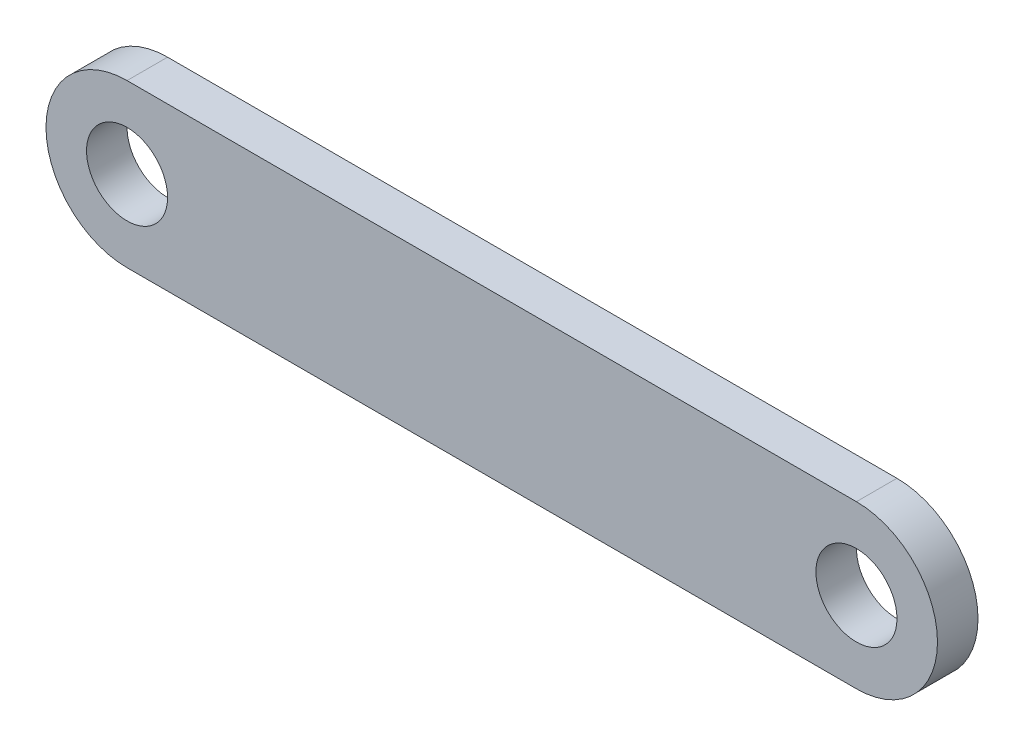
ISO-10303-21;
HEADER;
FILE_DESCRIPTION(('STEP AP214'),'2;1');
FILE_NAME('part.step','',(''),(''),'','','');
FILE_SCHEMA(('AUTOMOTIVE_DESIGN { 1 0 10303 214 1 1 1 1 }'));
ENDSEC;
DATA;
#1=APPLICATION_CONTEXT('core data for automotive mechanical design processes');
#2=APPLICATION_PROTOCOL_DEFINITION('international standard','automotive_design',2000,#1);
#3=PRODUCT_CONTEXT('',#1,'mechanical');
#4=PRODUCT('Part','Part','',(#3));
#5=PRODUCT_RELATED_PRODUCT_CATEGORY('part','',(#4));
#6=PRODUCT_DEFINITION_FORMATION('','',#4);
#7=PRODUCT_DEFINITION_CONTEXT('part definition',#1,'design');
#8=PRODUCT_DEFINITION('design','',#6,#7);
#9=PRODUCT_DEFINITION_SHAPE('','',#8);
#10=(LENGTH_UNIT() NAMED_UNIT(*) SI_UNIT(.MILLI.,.METRE.));
#11=(NAMED_UNIT(*) PLANE_ANGLE_UNIT() SI_UNIT($,.RADIAN.));
#12=(NAMED_UNIT(*) SI_UNIT($,.STERADIAN.) SOLID_ANGLE_UNIT());
#13=UNCERTAINTY_MEASURE_WITH_UNIT(LENGTH_MEASURE(1.E-05),#10,'distance_accuracy_value','');
#14=(GEOMETRIC_REPRESENTATION_CONTEXT(3) GLOBAL_UNCERTAINTY_ASSIGNED_CONTEXT((#13)) GLOBAL_UNIT_ASSIGNED_CONTEXT((#10,
#11,#12)) REPRESENTATION_CONTEXT('',''));
#15=CARTESIAN_POINT('',(0.,0.,0.));
#16=DIRECTION('',(0.,0.,1.));
#17=DIRECTION('',(1.,0.,0.));
#18=AXIS2_PLACEMENT_3D('',#15,#16,#17);
#19=CARTESIAN_POINT('',(-22.5,0.,2.5));
#20=DIRECTION('',(0.,0.,1.));
#21=DIRECTION('',(1.,0.,0.));
#22=AXIS2_PLACEMENT_3D('',#19,#20,#21);
#23=PLANE('',#22);
#24=CARTESIAN_POINT('',(-22.5,0.,2.5));
#25=DIRECTION('',(0.,0.,1.));
#26=DIRECTION('',(1.,0.,0.));
#27=AXIS2_PLACEMENT_3D('',#24,#25,#26);
#28=CIRCLE('',#27,2.5);
#29=CARTESIAN_POINT('',(-20.,0.,2.5));
#30=VERTEX_POINT('',#29);
#31=EDGE_CURVE('E116',#30,#30,#28,.T.);
#32=ORIENTED_EDGE('',*,*,#31,.F.);
#33=EDGE_LOOP('',(#32));
#34=FACE_BOUND('',#33,.T.);
#35=CARTESIAN_POINT('',(-22.5,0.,2.5));
#36=DIRECTION('',(0.,0.,1.));
#37=DIRECTION('',(1.,0.,0.));
#38=AXIS2_PLACEMENT_3D('',#35,#36,#37);
#39=CIRCLE('',#38,5.);
#40=CARTESIAN_POINT('',(-22.5,5.,2.5));
#41=VERTEX_POINT('',#40);
#42=CARTESIAN_POINT('',(-22.5,-5.,2.5));
#43=VERTEX_POINT('',#42);
#44=EDGE_CURVE('E96',#41,#43,#39,.T.);
#45=ORIENTED_EDGE('',*,*,#44,.T.);
#46=DIRECTION('',(1.,0.,0.));
#47=VECTOR('',#46,1.);
#48=CARTESIAN_POINT('',(-22.5,-5.,2.5));
#49=LINE('',#48,#47);
#50=CARTESIAN_POINT('',(22.5,-5.,2.5));
#51=VERTEX_POINT('',#50);
#52=EDGE_CURVE('E91',#43,#51,#49,.T.);
#53=ORIENTED_EDGE('',*,*,#52,.T.);
#54=CARTESIAN_POINT('',(22.5,0.,2.5));
#55=DIRECTION('',(0.,0.,1.));
#56=DIRECTION('',(1.,0.,0.));
#57=AXIS2_PLACEMENT_3D('',#54,#55,#56);
#58=CIRCLE('',#57,5.);
#59=CARTESIAN_POINT('',(22.5,5.,2.5));
#60=VERTEX_POINT('',#59);
#61=EDGE_CURVE('E94',#51,#60,#58,.T.);
#62=ORIENTED_EDGE('',*,*,#61,.T.);
#63=DIRECTION('',(-1.,0.,0.));
#64=VECTOR('',#63,1.);
#65=CARTESIAN_POINT('',(-22.5,5.,2.5));
#66=LINE('',#65,#64);
#67=EDGE_CURVE('E61',#60,#41,#66,.T.);
#68=ORIENTED_EDGE('',*,*,#67,.T.);
#69=EDGE_LOOP('',(#45,#53,#62,#68));
#70=FACE_BOUND('',#69,.T.);
#71=CARTESIAN_POINT('',(22.5,0.,2.5));
#72=DIRECTION('',(0.,0.,1.));
#73=DIRECTION('',(1.,0.,0.));
#74=AXIS2_PLACEMENT_3D('',#71,#72,#73);
#75=CIRCLE('',#74,2.5);
#76=CARTESIAN_POINT('',(25.,0.,2.5));
#77=VERTEX_POINT('',#76);
#78=EDGE_CURVE('E138',#77,#77,#75,.T.);
#79=ORIENTED_EDGE('',*,*,#78,.F.);
#80=EDGE_LOOP('',(#79));
#81=FACE_BOUND('',#80,.T.);
#82=ADVANCED_FACE('F43',(#34,#70,#81),#23,.T.);
#83=CARTESIAN_POINT('',(-22.5,0.,0.));
#84=DIRECTION('',(0.,0.,1.));
#85=DIRECTION('',(1.,0.,0.));
#86=AXIS2_PLACEMENT_3D('',#83,#84,#85);
#87=PLANE('',#86);
#88=CARTESIAN_POINT('',(-22.5,0.,0.));
#89=DIRECTION('',(0.,0.,1.));
#90=DIRECTION('',(1.,0.,0.));
#91=AXIS2_PLACEMENT_3D('',#88,#89,#90);
#92=CIRCLE('',#91,5.);
#93=CARTESIAN_POINT('',(-22.5,5.,0.));
#94=VERTEX_POINT('',#93);
#95=CARTESIAN_POINT('',(-22.5,-5.,0.));
#96=VERTEX_POINT('',#95);
#97=EDGE_CURVE('E112',#94,#96,#92,.T.);
#98=ORIENTED_EDGE('',*,*,#97,.F.);
#99=DIRECTION('',(-1.,0.,0.));
#100=VECTOR('',#99,1.);
#101=CARTESIAN_POINT('',(-22.5,5.,0.));
#102=LINE('',#101,#100);
#103=CARTESIAN_POINT('',(22.5,5.,0.));
#104=VERTEX_POINT('',#103);
#105=EDGE_CURVE('E84',#104,#94,#102,.T.);
#106=ORIENTED_EDGE('',*,*,#105,.F.);
#107=CARTESIAN_POINT('',(22.5,0.,0.));
#108=DIRECTION('',(0.,0.,1.));
#109=DIRECTION('',(1.,0.,0.));
#110=AXIS2_PLACEMENT_3D('',#107,#108,#109);
#111=CIRCLE('',#110,5.);
#112=CARTESIAN_POINT('',(22.5,-5.,0.));
#113=VERTEX_POINT('',#112);
#114=EDGE_CURVE('E78',#113,#104,#111,.T.);
#115=ORIENTED_EDGE('',*,*,#114,.F.);
#116=DIRECTION('',(1.,0.,0.));
#117=VECTOR('',#116,1.);
#118=CARTESIAN_POINT('',(-22.5,-5.,0.));
#119=LINE('',#118,#117);
#120=EDGE_CURVE('E101',#96,#113,#119,.T.);
#121=ORIENTED_EDGE('',*,*,#120,.F.);
#122=EDGE_LOOP('',(#98,#106,#115,#121));
#123=FACE_BOUND('',#122,.T.);
#124=CARTESIAN_POINT('',(-22.5,0.,0.));
#125=DIRECTION('',(0.,0.,1.));
#126=DIRECTION('',(1.,0.,0.));
#127=AXIS2_PLACEMENT_3D('',#124,#125,#126);
#128=CIRCLE('',#127,2.5);
#129=CARTESIAN_POINT('',(-20.,0.,0.));
#130=VERTEX_POINT('',#129);
#131=EDGE_CURVE('E134',#130,#130,#128,.T.);
#132=ORIENTED_EDGE('',*,*,#131,.T.);
#133=EDGE_LOOP('',(#132));
#134=FACE_BOUND('',#133,.T.);
#135=CARTESIAN_POINT('',(22.5,0.,0.));
#136=DIRECTION('',(0.,0.,1.));
#137=DIRECTION('',(1.,0.,0.));
#138=AXIS2_PLACEMENT_3D('',#135,#136,#137);
#139=CIRCLE('',#138,2.5);
#140=CARTESIAN_POINT('',(25.,0.,0.));
#141=VERTEX_POINT('',#140);
#142=EDGE_CURVE('E142',#141,#141,#139,.T.);
#143=ORIENTED_EDGE('',*,*,#142,.T.);
#144=EDGE_LOOP('',(#143));
#145=FACE_BOUND('',#144,.T.);
#146=ADVANCED_FACE('F129',(#123,#134,#145),#87,.F.);
#147=CARTESIAN_POINT('',(-22.5,0.,2.5));
#148=DIRECTION('',(0.,0.,-1.));
#149=DIRECTION('',(-1.,0.,0.));
#150=AXIS2_PLACEMENT_3D('',#147,#148,#149);
#151=CYLINDRICAL_SURFACE('',#150,5.);
#152=ORIENTED_EDGE('',*,*,#97,.T.);
#153=DIRECTION('',(0.,0.,-1.));
#154=VECTOR('',#153,1.);
#155=CARTESIAN_POINT('',(-22.5,-5.,2.5));
#156=LINE('',#155,#154);
#157=EDGE_CURVE('E11',#43,#96,#156,.T.);
#158=ORIENTED_EDGE('',*,*,#157,.F.);
#159=ORIENTED_EDGE('',*,*,#44,.F.);
#160=DIRECTION('',(0.,0.,-1.));
#161=VECTOR('',#160,1.);
#162=CARTESIAN_POINT('',(-22.5,5.,2.5));
#163=LINE('',#162,#161);
#164=EDGE_CURVE('E108',#41,#94,#163,.T.);
#165=ORIENTED_EDGE('',*,*,#164,.T.);
#166=EDGE_LOOP('',(#152,#158,#159,#165));
#167=FACE_BOUND('',#166,.T.);
#168=ADVANCED_FACE('F45',(#167),#151,.T.);
#169=CARTESIAN_POINT('',(-22.5,-5.,2.5));
#170=DIRECTION('',(0.,1.,0.));
#171=DIRECTION('',(0.,0.,1.));
#172=AXIS2_PLACEMENT_3D('',#169,#170,#171);
#173=PLANE('',#172);
#174=ORIENTED_EDGE('',*,*,#120,.T.);
#175=DIRECTION('',(0.,0.,-1.));
#176=VECTOR('',#175,1.);
#177=CARTESIAN_POINT('',(22.5,-5.,2.5));
#178=LINE('',#177,#176);
#179=EDGE_CURVE('E53',#51,#113,#178,.T.);
#180=ORIENTED_EDGE('',*,*,#179,.F.);
#181=ORIENTED_EDGE('',*,*,#52,.F.);
#182=ORIENTED_EDGE('',*,*,#157,.T.);
#183=EDGE_LOOP('',(#174,#180,#181,#182));
#184=FACE_BOUND('',#183,.T.);
#185=ADVANCED_FACE('F100',(#184),#173,.F.);
#186=CARTESIAN_POINT('',(22.5,0.,2.5));
#187=DIRECTION('',(0.,0.,-1.));
#188=DIRECTION('',(-1.,0.,0.));
#189=AXIS2_PLACEMENT_3D('',#186,#187,#188);
#190=CYLINDRICAL_SURFACE('',#189,5.);
#191=ORIENTED_EDGE('',*,*,#114,.T.);
#192=DIRECTION('',(0.,0.,-1.));
#193=VECTOR('',#192,1.);
#194=CARTESIAN_POINT('',(22.5,5.,2.5));
#195=LINE('',#194,#193);
#196=EDGE_CURVE('E103',#60,#104,#195,.T.);
#197=ORIENTED_EDGE('',*,*,#196,.F.);
#198=ORIENTED_EDGE('',*,*,#61,.F.);
#199=ORIENTED_EDGE('',*,*,#179,.T.);
#200=EDGE_LOOP('',(#191,#197,#198,#199));
#201=FACE_BOUND('',#200,.T.);
#202=ADVANCED_FACE('F104',(#201),#190,.T.);
#203=CARTESIAN_POINT('',(-22.5,5.,2.5));
#204=DIRECTION('',(0.,-1.,0.));
#205=DIRECTION('',(0.,0.,-1.));
#206=AXIS2_PLACEMENT_3D('',#203,#204,#205);
#207=PLANE('',#206);
#208=ORIENTED_EDGE('',*,*,#105,.T.);
#209=ORIENTED_EDGE('',*,*,#164,.F.);
#210=ORIENTED_EDGE('',*,*,#67,.F.);
#211=ORIENTED_EDGE('',*,*,#196,.T.);
#212=EDGE_LOOP('',(#208,#209,#210,#211));
#213=FACE_BOUND('',#212,.T.);
#214=ADVANCED_FACE('F126',(#213),#207,.F.);
#215=CARTESIAN_POINT('',(-22.5,0.,2.5));
#216=DIRECTION('',(0.,0.,-1.));
#217=DIRECTION('',(-1.,0.,0.));
#218=AXIS2_PLACEMENT_3D('',#215,#216,#217);
#219=CYLINDRICAL_SURFACE('',#218,2.5);
#220=ORIENTED_EDGE('',*,*,#31,.T.);
#221=EDGE_LOOP('',(#220));
#222=FACE_BOUND('',#221,.T.);
#223=ORIENTED_EDGE('',*,*,#131,.F.);
#224=EDGE_LOOP('',(#223));
#225=FACE_BOUND('',#224,.T.);
#226=ADVANCED_FACE('F161',(#222,#225),#219,.F.);
#227=CARTESIAN_POINT('',(22.5,0.,2.5));
#228=DIRECTION('',(0.,0.,-1.));
#229=DIRECTION('',(-1.,0.,0.));
#230=AXIS2_PLACEMENT_3D('',#227,#228,#229);
#231=CYLINDRICAL_SURFACE('',#230,2.5);
#232=ORIENTED_EDGE('',*,*,#78,.T.);
#233=EDGE_LOOP('',(#232));
#234=FACE_BOUND('',#233,.T.);
#235=ORIENTED_EDGE('',*,*,#142,.F.);
#236=EDGE_LOOP('',(#235));
#237=FACE_BOUND('',#236,.T.);
#238=ADVANCED_FACE('F150',(#234,#237),#231,.F.);
#239=CLOSED_SHELL('',(#82,#146,#168,#185,#202,#214,#226,#238));
#240=MANIFOLD_SOLID_BREP('B2',#239);
#241=ADVANCED_BREP_SHAPE_REPRESENTATION('',(#18,#240),#14);
#242=SHAPE_DEFINITION_REPRESENTATION(#9,#241);
ENDSEC;
END-ISO-10303-21;
